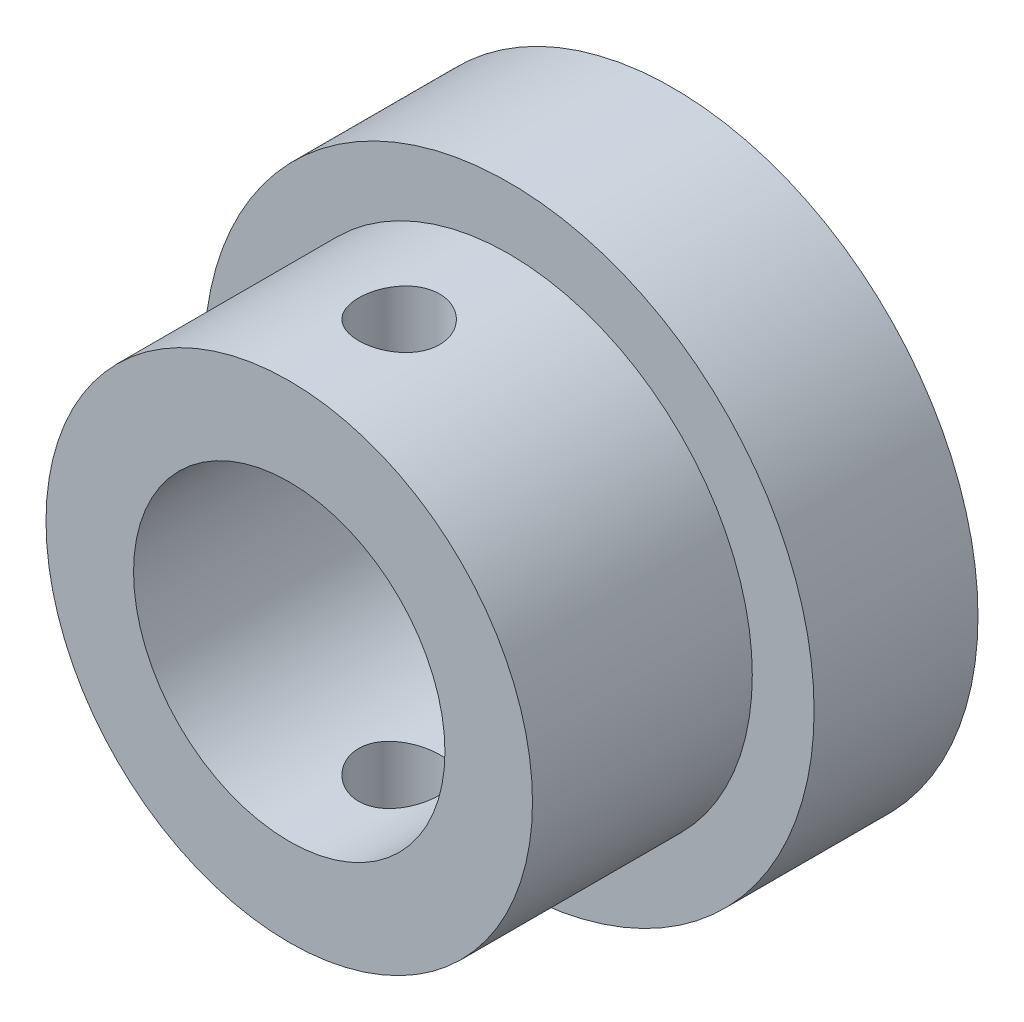
ISO-10303-21;
HEADER;
FILE_DESCRIPTION(('STEP AP214'),'2;1');
FILE_NAME('part.step','',(''),(''),'','','');
FILE_SCHEMA(('AUTOMOTIVE_DESIGN { 1 0 10303 214 1 1 1 1 }'));
ENDSEC;
DATA;
#1=APPLICATION_CONTEXT('core data for automotive mechanical design processes');
#2=APPLICATION_PROTOCOL_DEFINITION('international standard','automotive_design',2000,#1);
#3=PRODUCT_CONTEXT('',#1,'mechanical');
#4=PRODUCT('Part','Part','',(#3));
#5=PRODUCT_RELATED_PRODUCT_CATEGORY('part','',(#4));
#6=PRODUCT_DEFINITION_FORMATION('','',#4);
#7=PRODUCT_DEFINITION_CONTEXT('part definition',#1,'design');
#8=PRODUCT_DEFINITION('design','',#6,#7);
#9=PRODUCT_DEFINITION_SHAPE('','',#8);
#10=(LENGTH_UNIT() NAMED_UNIT(*) SI_UNIT(.MILLI.,.METRE.));
#11=(NAMED_UNIT(*) PLANE_ANGLE_UNIT() SI_UNIT($,.RADIAN.));
#12=(NAMED_UNIT(*) SI_UNIT($,.STERADIAN.) SOLID_ANGLE_UNIT());
#13=UNCERTAINTY_MEASURE_WITH_UNIT(LENGTH_MEASURE(1.E-05),#10,'distance_accuracy_value','');
#14=(GEOMETRIC_REPRESENTATION_CONTEXT(3) GLOBAL_UNCERTAINTY_ASSIGNED_CONTEXT((#13)) GLOBAL_UNIT_ASSIGNED_CONTEXT((#10,
#11,#12)) REPRESENTATION_CONTEXT('',''));
#15=CARTESIAN_POINT('',(0.,0.,0.));
#16=DIRECTION('',(0.,0.,1.));
#17=DIRECTION('',(1.,0.,0.));
#18=AXIS2_PLACEMENT_3D('',#15,#16,#17);
#19=CARTESIAN_POINT('',(0.,0.,8.5));
#20=DIRECTION('',(0.,0.,-1.));
#21=DIRECTION('',(-1.,0.,0.));
#22=AXIS2_PLACEMENT_3D('',#19,#20,#21);
#23=CYLINDRICAL_SURFACE('',#22,15.82);
#24=CARTESIAN_POINT('',(0.,0.,8.5));
#25=DIRECTION('',(0.,0.,1.));
#26=DIRECTION('',(1.,0.,0.));
#27=AXIS2_PLACEMENT_3D('',#24,#25,#26);
#28=CIRCLE('',#27,15.82);
#29=CARTESIAN_POINT('',(15.82,0.,8.5));
#30=VERTEX_POINT('',#29);
#31=EDGE_CURVE('E56',#30,#30,#28,.T.);
#32=ORIENTED_EDGE('',*,*,#31,.F.);
#33=EDGE_LOOP('',(#32));
#34=FACE_BOUND('',#33,.T.);
#35=CARTESIAN_POINT('',(0.,0.,0.));
#36=DIRECTION('',(0.,0.,1.));
#37=DIRECTION('',(1.,0.,0.));
#38=AXIS2_PLACEMENT_3D('',#35,#36,#37);
#39=CIRCLE('',#38,15.82);
#40=CARTESIAN_POINT('',(15.82,0.,0.));
#41=VERTEX_POINT('',#40);
#42=EDGE_CURVE('E62',#41,#41,#39,.T.);
#43=ORIENTED_EDGE('',*,*,#42,.T.);
#44=EDGE_LOOP('',(#43));
#45=FACE_BOUND('',#44,.T.);
#46=ADVANCED_FACE('F43',(#34,#45),#23,.T.);
#47=CARTESIAN_POINT('',(0.,0.,8.5));
#48=DIRECTION('',(0.,0.,1.));
#49=DIRECTION('',(1.,0.,0.));
#50=AXIS2_PLACEMENT_3D('',#47,#48,#49);
#51=PLANE('',#50);
#52=CARTESIAN_POINT('',(0.,0.,8.5));
#53=DIRECTION('',(0.,0.,1.));
#54=DIRECTION('',(1.,0.,0.));
#55=AXIS2_PLACEMENT_3D('',#52,#53,#54);
#56=CIRCLE('',#55,12.615);
#57=CARTESIAN_POINT('',(12.615,0.,8.5));
#58=VERTEX_POINT('',#57);
#59=EDGE_CURVE('E10',#58,#58,#56,.T.);
#60=ORIENTED_EDGE('',*,*,#59,.F.);
#61=EDGE_LOOP('',(#60));
#62=FACE_BOUND('',#61,.T.);
#63=ORIENTED_EDGE('',*,*,#31,.T.);
#64=EDGE_LOOP('',(#63));
#65=FACE_BOUND('',#64,.T.);
#66=ADVANCED_FACE('F108',(#62,#65),#51,.T.);
#67=CARTESIAN_POINT('',(0.,0.,0.));
#68=DIRECTION('',(0.,0.,1.));
#69=DIRECTION('',(1.,0.,0.));
#70=AXIS2_PLACEMENT_3D('',#67,#68,#69);
#71=PLANE('',#70);
#72=CARTESIAN_POINT('',(0.,0.,0.));
#73=DIRECTION('',(0.,0.,1.));
#74=DIRECTION('',(1.,0.,0.));
#75=AXIS2_PLACEMENT_3D('',#72,#73,#74);
#76=CIRCLE('',#75,8.075);
#77=CARTESIAN_POINT('',(8.075,0.,0.));
#78=VERTEX_POINT('',#77);
#79=EDGE_CURVE('E184',#78,#78,#76,.T.);
#80=ORIENTED_EDGE('',*,*,#79,.T.);
#81=EDGE_LOOP('',(#80));
#82=FACE_BOUND('',#81,.T.);
#83=ORIENTED_EDGE('',*,*,#42,.F.);
#84=EDGE_LOOP('',(#83));
#85=FACE_BOUND('',#84,.T.);
#86=ADVANCED_FACE('F106',(#82,#85),#71,.F.);
#87=CARTESIAN_POINT('',(0.,0.,19.9));
#88=DIRECTION('',(0.,0.,-1.));
#89=DIRECTION('',(-1.,0.,0.));
#90=AXIS2_PLACEMENT_3D('',#87,#88,#89);
#91=CYLINDRICAL_SURFACE('',#90,12.615);
#92=CARTESIAN_POINT('',(0.,-12.615,16.3));
#93=CARTESIAN_POINT('',(0.117090405145463,-12.6149979951424,16.2999953034061));
#94=CARTESIAN_POINT('',(0.234244762496019,-12.6133527965061,16.2901739459982));
#95=CARTESIAN_POINT('',(0.465267802156697,-12.606948197643,16.2511642685712));
#96=CARTESIAN_POINT('',(0.579133360166437,-12.6021859316816,16.2219581264391));
#97=CARTESIAN_POINT('',(0.800202935274686,-12.5900813617941,16.1450850292527));
#98=CARTESIAN_POINT('',(0.907412313518202,-12.5827411668077,16.0974331609433));
#99=CARTESIAN_POINT('',(1.11230021449141,-12.5662878661613,15.9850607363471));
#100=CARTESIAN_POINT('',(1.20997982843383,-12.5571749638451,15.9203421374488));
#101=CARTESIAN_POINT('',(1.3939808379462,-12.538089324338,15.7750166937184));
#102=CARTESIAN_POINT('',(1.48019814914859,-12.5281099108705,15.6942789272705));
#103=CARTESIAN_POINT('',(1.63792809105368,-12.50846710681,15.5194887870758));
#104=CARTESIAN_POINT('',(1.70943979447748,-12.4988037361779,15.4254355743393));
#105=CARTESIAN_POINT('',(1.83614551821716,-12.4808224645846,15.2259696071063));
#106=CARTESIAN_POINT('',(1.89123664541632,-12.4725131896728,15.1204906468871));
#107=CARTESIAN_POINT('',(1.98287939812365,-12.4582734986611,14.901614430325));
#108=CARTESIAN_POINT('',(2.01943227288597,-12.4523429222714,14.7882177081296));
#109=CARTESIAN_POINT('',(2.07263304970447,-12.4435985405567,14.5578280556389));
#110=CARTESIAN_POINT('',(2.08946062077617,-12.4407566196536,14.4408777011733));
#111=CARTESIAN_POINT('',(2.10329017495741,-12.4384262608812,14.2057815073396));
#112=CARTESIAN_POINT('',(2.10029355780353,-12.4389375862474,14.0876357529638));
#113=CARTESIAN_POINT('',(2.07470615099254,-12.4432302770752,13.854784902341));
#114=CARTESIAN_POINT('',(2.05231717418089,-12.4469779611269,13.7400569180807));
#115=CARTESIAN_POINT('',(1.98889729289166,-12.4572683766694,13.5160088044262));
#116=CARTESIAN_POINT('',(1.94786575043135,-12.4638112038146,13.4066888602469));
#117=CARTESIAN_POINT('',(1.84812079533438,-12.4789910861851,13.1959557313876));
#118=CARTESIAN_POINT('',(1.78932355818068,-12.4876380308445,13.0945829644808));
#119=CARTESIAN_POINT('',(1.65577576903985,-12.5060449837134,12.9030659733394));
#120=CARTESIAN_POINT('',(1.58102393244177,-12.5158050815208,12.8129226541884));
#121=CARTESIAN_POINT('',(1.41658919906534,-12.535486624781,12.6452551958064));
#122=CARTESIAN_POINT('',(1.32673314604142,-12.5454085732725,12.567900832745));
#123=CARTESIAN_POINT('',(1.1352263466953,-12.5641843238819,12.429342129774));
#124=CARTESIAN_POINT('',(1.03357552471818,-12.5730381191477,12.3681378934639));
#125=CARTESIAN_POINT('',(0.82120520124206,-12.5886925137681,12.2636014380403));
#126=CARTESIAN_POINT('',(0.710478193856231,-12.5954913915055,12.2202841936475));
#127=CARTESIAN_POINT('',(0.483182211548695,-12.6062560645897,12.1529087788152));
#128=CARTESIAN_POINT('',(0.366613725024102,-12.6102220963649,12.1288490011337));
#129=CARTESIAN_POINT('',(0.132407075119206,-12.6148424263685,12.1009015872823));
#130=CARTESIAN_POINT('',(0.0147974522636623,-12.6155349867859,12.0967808783917));
#131=CARTESIAN_POINT('',(-0.219431767433047,-12.6136351303052,12.1082072268546));
#132=CARTESIAN_POINT('',(-0.336051402100723,-12.6110428394922,12.1237535293139));
#133=CARTESIAN_POINT('',(-0.564270499835416,-12.6028882470064,12.1738787458371));
#134=CARTESIAN_POINT('',(-0.675896000683405,-12.59734395419,12.2083422931837));
#135=CARTESIAN_POINT('',(-0.891784796815733,-12.5839045637239,12.2952007370322));
#136=CARTESIAN_POINT('',(-0.996047679089691,-12.5760093343265,12.3475966384976));
#137=CARTESIAN_POINT('',(-1.195264130417,-12.5586490789079,12.4693664363102));
#138=CARTESIAN_POINT('',(-1.29012751697149,-12.5491708261534,12.5388859500024));
#139=CARTESIAN_POINT('',(-1.46692482088962,-12.5297358967021,12.6927292238493));
#140=CARTESIAN_POINT('',(-1.54885780066186,-12.5197791853802,12.7770540566107));
#141=CARTESIAN_POINT('',(-1.69833226030131,-12.5003858344664,12.9591595142942));
#142=CARTESIAN_POINT('',(-1.76571628213398,-12.4909556319804,13.0570701763791));
#143=CARTESIAN_POINT('',(-1.88308041907004,-12.4738031821253,13.2629580369427));
#144=CARTESIAN_POINT('',(-1.93306108490452,-12.4660808807123,13.3709349167377));
#145=CARTESIAN_POINT('',(-2.01396414935522,-12.4532668581825,13.5934495175217));
#146=CARTESIAN_POINT('',(-2.04496497813,-12.4481643257406,13.7079580717201));
#147=CARTESIAN_POINT('',(-2.08727519645551,-12.4411404289967,13.9406491282067));
#148=CARTESIAN_POINT('',(-2.09858629346993,-12.4392187888532,14.0588313110186));
#149=CARTESIAN_POINT('',(-2.10114843878461,-12.4387861195739,14.2939425583894));
#150=CARTESIAN_POINT('',(-2.09264733277958,-12.4402329514662,14.4108689184299));
#151=CARTESIAN_POINT('',(-2.05636225169382,-12.4462818606994,14.6416028954854));
#152=CARTESIAN_POINT('',(-2.02857833868577,-12.4508839278836,14.7554105225386));
#153=CARTESIAN_POINT('',(-1.95461117967956,-12.4627087734664,14.9765809470632));
#154=CARTESIAN_POINT('',(-1.90844922220213,-12.469928518772,15.0839510365665));
#155=CARTESIAN_POINT('',(-1.79906180289613,-12.486178189114,15.2894627565796));
#156=CARTESIAN_POINT('',(-1.7358354980487,-12.4952082035762,15.3876039308364));
#157=CARTESIAN_POINT('',(-1.59322942879022,-12.514194569954,15.5731242093798));
#158=CARTESIAN_POINT('',(-1.51366731579548,-12.5241606216413,15.6603621729205));
#159=CARTESIAN_POINT('',(-1.34103255529392,-12.5438187272978,15.820333957209));
#160=CARTESIAN_POINT('',(-1.24795679384264,-12.5535107174983,15.8930644258062));
#161=CARTESIAN_POINT('',(-1.05017499467409,-12.5716060111072,16.0224143446602));
#162=CARTESIAN_POINT('',(-0.945393264380169,-12.5799999783229,16.0789193729301));
#163=CARTESIAN_POINT('',(-0.727728249262895,-12.5944625680724,16.1734389234143));
#164=CARTESIAN_POINT('',(-0.614853166402668,-12.6005335063423,16.2114718699599));
#165=CARTESIAN_POINT('',(-0.417948959566506,-12.608340471702,16.2597081483539));
#166=CARTESIAN_POINT('',(-0.33511125674187,-12.6108244523752,16.2747934066568));
#167=CARTESIAN_POINT('',(-0.1681933557398,-12.6141549225872,16.2949409334499));
#168=CARTESIAN_POINT('',(-0.0841131788979997,-12.6150014402115,16.3000033738499));
#169=CARTESIAN_POINT('',(0.,-12.615,16.3));
#170=B_SPLINE_CURVE_WITH_KNOTS('',3,(#92,#93,#94,#95,#96,#97,#98,#99,#100,#101,#102,#103,#104,
#105,#106,#107,#108,#109,#110,#111,#112,#113,#114,#115,#116,#117,#118,#119,#120,#121,#122,#123,
#124,#125,#126,#127,#128,#129,#130,#131,#132,#133,#134,#135,#136,#137,#138,#139,#140,#141,#142,
#143,#144,#145,#146,#147,#148,#149,#150,#151,#152,#153,#154,#155,#156,#157,#158,#159,#160,#161,
#162,#163,#164,#165,#166,#167,#168,#169),.UNSPECIFIED.,.T.,.F.,(4,2,2,2,2,2,2,2,2,2,2,2,2,2,2,2,
2,2,2,2,2,2,2,2,2,2,2,2,2,2,2,2,2,2,2,2,2,2,4),(0.,0.350963758331684,0.702250635861975,
1.05325080115011,1.40421072761578,1.75816680789181,2.11214520043376,2.46829715575193,
2.82442510754323,3.17728340175088,3.53011678177853,3.87932181268244,4.22853879492235,
4.57942993622639,4.93034934077613,5.2856068642165,5.64086666650275,5.99642328689567,
6.35195022918237,6.70331112033582,7.05465852534324,7.40388666950032,7.75313438827724,
8.10546132835634,8.45781380414244,8.81380719521221,9.16978931980863,9.52429031602075,
9.87876056891219,10.2288203315031,10.5788789672326,10.9285332809399,11.2782048715549,
11.6320155011516,11.9859077889616,12.3422376584922,12.6982113856478,12.9503343815631,
13.2024530530682),.UNSPECIFIED.);
#171=CARTESIAN_POINT('',(0.,-12.615,16.3));
#172=VERTEX_POINT('',#171);
#173=EDGE_CURVE('E96',#172,#172,#170,.T.);
#174=ORIENTED_EDGE('',*,*,#173,.T.);
#175=EDGE_LOOP('',(#174));
#176=FACE_BOUND('',#175,.T.);
#177=CARTESIAN_POINT('',(0.,12.615,16.3));
#178=CARTESIAN_POINT('',(-0.117090405145463,12.6149979951424,16.2999953034061));
#179=CARTESIAN_POINT('',(-0.234244762496019,12.6133527965061,16.2901739459982));
#180=CARTESIAN_POINT('',(-0.465267802156697,12.606948197643,16.2511642685712));
#181=CARTESIAN_POINT('',(-0.579133360166437,12.6021859316816,16.2219581264391));
#182=CARTESIAN_POINT('',(-0.800202935274686,12.5900813617941,16.1450850292527));
#183=CARTESIAN_POINT('',(-0.907412313518202,12.5827411668077,16.0974331609433));
#184=CARTESIAN_POINT('',(-1.11230021449141,12.5662878661613,15.9850607363471));
#185=CARTESIAN_POINT('',(-1.20997982843383,12.5571749638451,15.9203421374488));
#186=CARTESIAN_POINT('',(-1.3939808379462,12.538089324338,15.7750166937184));
#187=CARTESIAN_POINT('',(-1.48019814914859,12.5281099108705,15.6942789272705));
#188=CARTESIAN_POINT('',(-1.63792809105368,12.50846710681,15.5194887870758));
#189=CARTESIAN_POINT('',(-1.70943979447748,12.4988037361779,15.4254355743393));
#190=CARTESIAN_POINT('',(-1.83614551821716,12.4808224645846,15.2259696071063));
#191=CARTESIAN_POINT('',(-1.89123664541632,12.4725131896728,15.1204906468871));
#192=CARTESIAN_POINT('',(-1.98287939812365,12.4582734986611,14.901614430325));
#193=CARTESIAN_POINT('',(-2.01943227288597,12.4523429222714,14.7882177081296));
#194=CARTESIAN_POINT('',(-2.07263304970447,12.4435985405567,14.5578280556389));
#195=CARTESIAN_POINT('',(-2.08946062077617,12.4407566196536,14.4408777011733));
#196=CARTESIAN_POINT('',(-2.10329017495741,12.4384262608812,14.2057815073396));
#197=CARTESIAN_POINT('',(-2.10029355780353,12.4389375862474,14.0876357529638));
#198=CARTESIAN_POINT('',(-2.07470615099254,12.4432302770752,13.854784902341));
#199=CARTESIAN_POINT('',(-2.05231717418089,12.4469779611269,13.7400569180807));
#200=CARTESIAN_POINT('',(-1.98889729289166,12.4572683766694,13.5160088044262));
#201=CARTESIAN_POINT('',(-1.94786575043135,12.4638112038146,13.4066888602469));
#202=CARTESIAN_POINT('',(-1.84812079533438,12.4789910861851,13.1959557313876));
#203=CARTESIAN_POINT('',(-1.78932355818068,12.4876380308445,13.0945829644808));
#204=CARTESIAN_POINT('',(-1.65577576903985,12.5060449837134,12.9030659733394));
#205=CARTESIAN_POINT('',(-1.58102393244177,12.5158050815208,12.8129226541884));
#206=CARTESIAN_POINT('',(-1.41658919906534,12.535486624781,12.6452551958064));
#207=CARTESIAN_POINT('',(-1.32673314604142,12.5454085732725,12.567900832745));
#208=CARTESIAN_POINT('',(-1.1352263466953,12.5641843238819,12.429342129774));
#209=CARTESIAN_POINT('',(-1.03357552471818,12.5730381191477,12.3681378934639));
#210=CARTESIAN_POINT('',(-0.82120520124206,12.5886925137681,12.2636014380403));
#211=CARTESIAN_POINT('',(-0.710478193856231,12.5954913915055,12.2202841936475));
#212=CARTESIAN_POINT('',(-0.483182211548695,12.6062560645897,12.1529087788152));
#213=CARTESIAN_POINT('',(-0.366613725024102,12.6102220963649,12.1288490011337));
#214=CARTESIAN_POINT('',(-0.132407075119206,12.6148424263685,12.1009015872823));
#215=CARTESIAN_POINT('',(-0.0147974522636623,12.6155349867859,12.0967808783917));
#216=CARTESIAN_POINT('',(0.219431767433047,12.6136351303052,12.1082072268546));
#217=CARTESIAN_POINT('',(0.336051402100723,12.6110428394922,12.1237535293139));
#218=CARTESIAN_POINT('',(0.564270499835416,12.6028882470064,12.1738787458371));
#219=CARTESIAN_POINT('',(0.675896000683405,12.59734395419,12.2083422931837));
#220=CARTESIAN_POINT('',(0.891784796815733,12.5839045637239,12.2952007370322));
#221=CARTESIAN_POINT('',(0.996047679089691,12.5760093343265,12.3475966384976));
#222=CARTESIAN_POINT('',(1.195264130417,12.5586490789079,12.4693664363102));
#223=CARTESIAN_POINT('',(1.29012751697149,12.5491708261534,12.5388859500024));
#224=CARTESIAN_POINT('',(1.46692482088962,12.5297358967021,12.6927292238493));
#225=CARTESIAN_POINT('',(1.54885780066186,12.5197791853802,12.7770540566107));
#226=CARTESIAN_POINT('',(1.69833226030131,12.5003858344664,12.9591595142942));
#227=CARTESIAN_POINT('',(1.76571628213398,12.4909556319804,13.0570701763791));
#228=CARTESIAN_POINT('',(1.88308041907004,12.4738031821253,13.2629580369427));
#229=CARTESIAN_POINT('',(1.93306108490452,12.4660808807123,13.3709349167377));
#230=CARTESIAN_POINT('',(2.01396414935522,12.4532668581825,13.5934495175217));
#231=CARTESIAN_POINT('',(2.04496497813,12.4481643257406,13.7079580717201));
#232=CARTESIAN_POINT('',(2.08727519645551,12.4411404289967,13.9406491282067));
#233=CARTESIAN_POINT('',(2.09858629346993,12.4392187888532,14.0588313110186));
#234=CARTESIAN_POINT('',(2.10114843878461,12.4387861195739,14.2939425583894));
#235=CARTESIAN_POINT('',(2.09264733277958,12.4402329514662,14.4108689184299));
#236=CARTESIAN_POINT('',(2.05636225169382,12.4462818606994,14.6416028954854));
#237=CARTESIAN_POINT('',(2.02857833868577,12.4508839278836,14.7554105225386));
#238=CARTESIAN_POINT('',(1.95461117967956,12.4627087734664,14.9765809470632));
#239=CARTESIAN_POINT('',(1.90844922220213,12.469928518772,15.0839510365665));
#240=CARTESIAN_POINT('',(1.79906180289613,12.486178189114,15.2894627565796));
#241=CARTESIAN_POINT('',(1.7358354980487,12.4952082035762,15.3876039308364));
#242=CARTESIAN_POINT('',(1.59322942879022,12.514194569954,15.5731242093798));
#243=CARTESIAN_POINT('',(1.51366731579548,12.5241606216413,15.6603621729205));
#244=CARTESIAN_POINT('',(1.34103255529392,12.5438187272978,15.820333957209));
#245=CARTESIAN_POINT('',(1.24795679384264,12.5535107174983,15.8930644258062));
#246=CARTESIAN_POINT('',(1.05017499467409,12.5716060111072,16.0224143446602));
#247=CARTESIAN_POINT('',(0.945393264380169,12.5799999783229,16.0789193729301));
#248=CARTESIAN_POINT('',(0.727728249262895,12.5944625680724,16.1734389234143));
#249=CARTESIAN_POINT('',(0.614853166402668,12.6005335063423,16.2114718699599));
#250=CARTESIAN_POINT('',(0.417948959566506,12.608340471702,16.2597081483539));
#251=CARTESIAN_POINT('',(0.33511125674187,12.6108244523752,16.2747934066568));
#252=CARTESIAN_POINT('',(0.1681933557398,12.6141549225872,16.2949409334499));
#253=CARTESIAN_POINT('',(0.0841131788979997,12.6150014402115,16.3000033738499));
#254=CARTESIAN_POINT('',(0.,12.615,16.3));
#255=B_SPLINE_CURVE_WITH_KNOTS('',3,(#177,#178,#179,#180,#181,#182,#183,#184,#185,#186,#187,
#188,#189,#190,#191,#192,#193,#194,#195,#196,#197,#198,#199,#200,#201,#202,#203,#204,#205,#206,
#207,#208,#209,#210,#211,#212,#213,#214,#215,#216,#217,#218,#219,#220,#221,#222,#223,#224,#225,
#226,#227,#228,#229,#230,#231,#232,#233,#234,#235,#236,#237,#238,#239,#240,#241,#242,#243,#244,
#245,#246,#247,#248,#249,#250,#251,#252,#253,#254),.UNSPECIFIED.,.T.,.F.,(4,2,2,2,2,2,2,2,2,2,2,
2,2,2,2,2,2,2,2,2,2,2,2,2,2,2,2,2,2,2,2,2,2,2,2,2,2,2,4),(0.,0.350963758331684,
0.702250635861975,1.05325080115011,1.40421072761578,1.75816680789181,2.11214520043376,
2.46829715575193,2.82442510754323,3.17728340175088,3.53011678177853,3.87932181268244,
4.22853879492235,4.57942993622639,4.93034934077613,5.2856068642165,5.64086666650275,
5.99642328689567,6.35195022918237,6.70331112033582,7.05465852534324,7.40388666950032,
7.75313438827724,8.10546132835634,8.45781380414244,8.81380719521221,9.16978931980863,
9.52429031602075,9.87876056891219,10.2288203315031,10.5788789672326,10.9285332809399,
11.2782048715549,11.6320155011516,11.9859077889616,12.3422376584922,12.6982113856478,
12.9503343815631,13.2024530530682),.UNSPECIFIED.);
#256=CARTESIAN_POINT('',(0.,12.615,16.3));
#257=VERTEX_POINT('',#256);
#258=EDGE_CURVE('E89',#257,#257,#255,.T.);
#259=ORIENTED_EDGE('',*,*,#258,.T.);
#260=EDGE_LOOP('',(#259));
#261=FACE_BOUND('',#260,.T.);
#262=CARTESIAN_POINT('',(0.,0.,19.9));
#263=DIRECTION('',(0.,0.,1.));
#264=DIRECTION('',(1.,0.,0.));
#265=AXIS2_PLACEMENT_3D('',#262,#263,#264);
#266=CIRCLE('',#265,12.615);
#267=CARTESIAN_POINT('',(12.615,0.,19.9));
#268=VERTEX_POINT('',#267);
#269=EDGE_CURVE('E65',#268,#268,#266,.T.);
#270=ORIENTED_EDGE('',*,*,#269,.F.);
#271=EDGE_LOOP('',(#270));
#272=FACE_BOUND('',#271,.T.);
#273=ORIENTED_EDGE('',*,*,#59,.T.);
#274=EDGE_LOOP('',(#273));
#275=FACE_BOUND('',#274,.T.);
#276=ADVANCED_FACE('F101',(#176,#261,#272,#275),#91,.T.);
#277=CARTESIAN_POINT('',(0.,0.,19.9));
#278=DIRECTION('',(0.,0.,1.));
#279=DIRECTION('',(1.,0.,0.));
#280=AXIS2_PLACEMENT_3D('',#277,#278,#279);
#281=PLANE('',#280);
#282=CARTESIAN_POINT('',(0.,0.,19.9));
#283=DIRECTION('',(0.,0.,1.));
#284=DIRECTION('',(1.,0.,0.));
#285=AXIS2_PLACEMENT_3D('',#282,#283,#284);
#286=CIRCLE('',#285,8.075);
#287=CARTESIAN_POINT('',(8.075,0.,19.9));
#288=VERTEX_POINT('',#287);
#289=EDGE_CURVE('E186',#288,#288,#286,.T.);
#290=ORIENTED_EDGE('',*,*,#289,.F.);
#291=EDGE_LOOP('',(#290));
#292=FACE_BOUND('',#291,.T.);
#293=ORIENTED_EDGE('',*,*,#269,.T.);
#294=EDGE_LOOP('',(#293));
#295=FACE_BOUND('',#294,.T.);
#296=ADVANCED_FACE('F105',(#292,#295),#281,.T.);
#297=CARTESIAN_POINT('',(0.,0.,0.));
#298=DIRECTION('',(0.,0.,1.));
#299=DIRECTION('',(1.,0.,0.));
#300=AXIS2_PLACEMENT_3D('',#297,#298,#299);
#301=CYLINDRICAL_SURFACE('',#300,8.075);
#302=CARTESIAN_POINT('',(0.,-8.075,16.3));
#303=CARTESIAN_POINT('',(-0.115871827424154,-8.07499815788605,16.2999970390839));
#304=CARTESIAN_POINT('',(-0.231775906926112,-8.07248128670506,16.2903776012231));
#305=CARTESIAN_POINT('',(-0.460252064256596,-8.06268519251354,16.2522178774469));
#306=CARTESIAN_POINT('',(-0.572822392621185,-8.05540351377743,16.2236678348201));
#307=CARTESIAN_POINT('',(-0.791299503739305,-8.03688257153905,16.1486326915667));
#308=CARTESIAN_POINT('',(-0.89721444873294,-8.02564827181474,16.1021700789166));
#309=CARTESIAN_POINT('',(-1.09974787488678,-8.00041304967934,15.9927103628068));
#310=CARTESIAN_POINT('',(-1.19636585795492,-7.98641197915889,15.9297123741247));
#311=CARTESIAN_POINT('',(-1.3797023703087,-7.95681154209011,15.7874969472279));
#312=CARTESIAN_POINT('',(-1.46618567650681,-7.94118591687267,15.7079817274427));
#313=CARTESIAN_POINT('',(-1.62475195125285,-7.91026841980203,15.5356259427291));
#314=CARTESIAN_POINT('',(-1.6968331603921,-7.89497658892928,15.4427837521109));
#315=CARTESIAN_POINT('',(-1.82567958964906,-7.8661910558391,15.2445525625502));
#316=CARTESIAN_POINT('',(-1.88217722434653,-7.85273056788817,15.1389843740494));
#317=CARTESIAN_POINT('',(-1.97653032740086,-7.82951659403045,14.9194413952651));
#318=CARTESIAN_POINT('',(-2.01438904721761,-7.81976246163738,14.8054680752036));
#319=CARTESIAN_POINT('',(-2.06957855821683,-7.80533621431595,14.5749478048913));
#320=CARTESIAN_POINT('',(-2.08733441059276,-7.80055904612993,14.4585093512755));
#321=CARTESIAN_POINT('',(-2.10313888292929,-7.79631351135099,14.2242159182912));
#322=CARTESIAN_POINT('',(-2.10119099132225,-7.79684420503206,14.1063611933555));
#323=CARTESIAN_POINT('',(-2.07798140194552,-7.80306024129093,13.8758740025415));
#324=CARTESIAN_POINT('',(-2.05723085616647,-7.80860915531351,13.7631858044134));
#325=CARTESIAN_POINT('',(-1.99782234336147,-7.82401837736178,13.5429478648741));
#326=CARTESIAN_POINT('',(-1.95916300768083,-7.83387901490178,13.4353985168856));
#327=CARTESIAN_POINT('',(-1.86461013792829,-7.85692271510677,13.2271434285085));
#328=CARTESIAN_POINT('',(-1.80853486908354,-7.87014053155793,13.1265242077332));
#329=CARTESIAN_POINT('',(-1.68086881154182,-7.89839021652879,12.9359424864975));
#330=CARTESIAN_POINT('',(-1.60927510444815,-7.9134224260272,12.8459819954455));
#331=CARTESIAN_POINT('',(-1.44997710627677,-7.94417768020489,12.6763473626967));
#332=CARTESIAN_POINT('',(-1.3618427142753,-7.95990770564848,12.5970778358259));
#333=CARTESIAN_POINT('',(-1.17334067744893,-7.98986800347974,12.4543634935913));
#334=CARTESIAN_POINT('',(-1.0729725962178,-8.00409822233179,12.3909192430008));
#335=CARTESIAN_POINT('',(-0.862245588790804,-8.02953613283629,12.2814902797917));
#336=CARTESIAN_POINT('',(-0.751848644210953,-8.0407316223874,12.2355757576579));
#337=CARTESIAN_POINT('',(-0.524545957278586,-8.05875025845912,12.1630723677646));
#338=CARTESIAN_POINT('',(-0.407641570865597,-8.06557431216582,12.1364794901097));
#339=CARTESIAN_POINT('',(-0.174098088141374,-8.07394518304003,12.1040025428632));
#340=CARTESIAN_POINT('',(-0.0575404520394964,-8.07563223893502,12.097568010568));
#341=CARTESIAN_POINT('',(0.174987522588724,-8.07394070236264,12.1040744312751));
#342=CARTESIAN_POINT('',(0.290957917519187,-8.07056260602884,12.117013486627));
#343=CARTESIAN_POINT('',(0.517075671335545,-8.05921063279311,12.1614473443897));
#344=CARTESIAN_POINT('',(0.627286962720303,-8.05131217294138,12.1926378299613));
#345=CARTESIAN_POINT('',(0.840904336533513,-8.03181296842914,12.2723381155217));
#346=CARTESIAN_POINT('',(0.944309699338374,-8.02021183302305,12.3208497434852));
#347=CARTESIAN_POINT('',(1.1435395205331,-7.99426254301436,12.4348546771997));
#348=CARTESIAN_POINT('',(1.23918421109676,-7.97986670399213,12.5006510159775));
#349=CARTESIAN_POINT('',(1.41826906845428,-7.94999337305592,12.6469741487984));
#350=CARTESIAN_POINT('',(1.50170694185814,-7.93451567869047,12.7275037045061));
#351=CARTESIAN_POINT('',(1.65630879109929,-7.90371154527326,12.9035712331707));
#352=CARTESIAN_POINT('',(1.72708524550091,-7.88840019770937,12.9994527309878));
#353=CARTESIAN_POINT('',(1.85154857471353,-7.86011973232361,13.2020523335951));
#354=CARTESIAN_POINT('',(1.90523618627563,-7.847150513536,13.3087699709452));
#355=CARTESIAN_POINT('',(1.99359403204249,-7.825169762581,13.5294606880192));
#356=CARTESIAN_POINT('',(2.02837591526294,-7.81613505931003,13.6433866358954));
#357=CARTESIAN_POINT('',(2.0782123995793,-7.80303368957822,13.8757431035615));
#358=CARTESIAN_POINT('',(2.09327174409945,-7.79896582856905,13.9941725331752));
#359=CARTESIAN_POINT('',(2.10297275547962,-7.7963550192497,14.2282166349057));
#360=CARTESIAN_POINT('',(2.09823582825744,-7.79764391496779,14.3438040701792));
#361=CARTESIAN_POINT('',(2.06991243787169,-7.8052096728301,14.5724710808921));
#362=CARTESIAN_POINT('',(2.04632641559524,-7.8114864183067,14.6855507149261));
#363=CARTESIAN_POINT('',(1.98132636088469,-7.82822308488921,14.9052530874019));
#364=CARTESIAN_POINT('',(1.94003790765334,-7.83865350384139,15.0119153831566));
#365=CARTESIAN_POINT('',(1.84090312666794,-7.86252431515174,15.2168779065387));
#366=CARTESIAN_POINT('',(1.78305432004485,-7.87596515806555,15.315176879426));
#367=CARTESIAN_POINT('',(1.65053155625944,-7.90481400022032,15.5036034302199));
#368=CARTESIAN_POINT('',(1.57543065640827,-7.92026664870569,15.5934239415864));
#369=CARTESIAN_POINT('',(1.41135561074052,-7.95114185174705,15.7593895973354));
#370=CARTESIAN_POINT('',(1.32237813043122,-7.96656439816537,15.8355314452957));
#371=CARTESIAN_POINT('',(1.13092336578401,-7.99601105142036,15.9734738648594));
#372=CARTESIAN_POINT('',(1.02821124385345,-8.01000093269915,16.0349563972789));
#373=CARTESIAN_POINT('',(0.813550841608095,-8.03463718970854,16.1396843066057));
#374=CARTESIAN_POINT('',(0.701608830458552,-8.04528581166144,16.1829419422647));
#375=CARTESIAN_POINT('',(0.491660634954398,-8.0605826159974,16.2440337603681));
#376=CARTESIAN_POINT('',(0.394599084716608,-8.06595065841885,16.2649737395439));
#377=CARTESIAN_POINT('',(0.198366109784046,-8.07315998246533,16.292957510303));
#378=CARTESIAN_POINT('',(0.0991948730677301,-8.07500157698608,16.3000025347636));
#379=CARTESIAN_POINT('',(0.,-8.075,16.3));
#380=B_SPLINE_CURVE_WITH_KNOTS('',3,(#302,#303,#304,#305,#306,#307,#308,#309,#310,#311,#312,
#313,#314,#315,#316,#317,#318,#319,#320,#321,#322,#323,#324,#325,#326,#327,#328,#329,#330,#331,
#332,#333,#334,#335,#336,#337,#338,#339,#340,#341,#342,#343,#344,#345,#346,#347,#348,#349,#350,
#351,#352,#353,#354,#355,#356,#357,#358,#359,#360,#361,#362,#363,#364,#365,#366,#367,#368,#369,
#370,#371,#372,#373,#374,#375,#376,#377,#378,#379),.UNSPECIFIED.,.T.,.F.,(4,2,2,2,2,2,2,2,2,2,2,
2,2,2,2,2,2,2,2,2,2,2,2,2,2,2,2,2,2,2,2,2,2,2,2,2,2,2,4),(0.,0.347251815022119,
0.694682740642506,1.04167890402442,1.38869364766054,1.74261303210576,2.09657562613492,
2.4562834299754,2.81592846244295,3.16781808133873,3.51964540133122,3.86218611257907,
4.20475300635028,4.55102201767935,4.89735620492654,5.25441115945375,5.6114788547516,
5.96996164750229,6.32837002167273,6.67690202685879,7.02539989543371,7.36824625795266,
7.71112881322446,8.06047845371332,8.40989364518772,8.76864503771846,9.12738096130823,
9.48397467023088,9.84048259982847,10.1858851668707,10.5312796550588,10.8742634690736,
11.2172986501637,11.5699689238689,11.9227240739293,12.2825496807864,12.642132867481,
12.9394325406784,13.2367058337591),.UNSPECIFIED.);
#381=CARTESIAN_POINT('',(0.,-8.075,16.3));
#382=VERTEX_POINT('',#381);
#383=EDGE_CURVE('E46',#382,#382,#380,.T.);
#384=ORIENTED_EDGE('',*,*,#383,.T.);
#385=EDGE_LOOP('',(#384));
#386=FACE_BOUND('',#385,.T.);
#387=CARTESIAN_POINT('',(0.,8.075,16.3));
#388=CARTESIAN_POINT('',(0.115871827424154,8.07499815788605,16.2999970390839));
#389=CARTESIAN_POINT('',(0.231775906926112,8.07248128670506,16.2903776012231));
#390=CARTESIAN_POINT('',(0.460252064256596,8.06268519251354,16.2522178774469));
#391=CARTESIAN_POINT('',(0.572822392621185,8.05540351377743,16.2236678348201));
#392=CARTESIAN_POINT('',(0.791299503739305,8.03688257153905,16.1486326915667));
#393=CARTESIAN_POINT('',(0.89721444873294,8.02564827181474,16.1021700789166));
#394=CARTESIAN_POINT('',(1.09974787488678,8.00041304967934,15.9927103628068));
#395=CARTESIAN_POINT('',(1.19636585795492,7.98641197915889,15.9297123741247));
#396=CARTESIAN_POINT('',(1.3797023703087,7.95681154209011,15.7874969472279));
#397=CARTESIAN_POINT('',(1.46618567650681,7.94118591687267,15.7079817274427));
#398=CARTESIAN_POINT('',(1.62475195125285,7.91026841980203,15.5356259427291));
#399=CARTESIAN_POINT('',(1.6968331603921,7.89497658892928,15.4427837521109));
#400=CARTESIAN_POINT('',(1.82567958964906,7.8661910558391,15.2445525625502));
#401=CARTESIAN_POINT('',(1.88217722434653,7.85273056788817,15.1389843740494));
#402=CARTESIAN_POINT('',(1.97653032740086,7.82951659403045,14.9194413952651));
#403=CARTESIAN_POINT('',(2.01438904721761,7.81976246163738,14.8054680752036));
#404=CARTESIAN_POINT('',(2.06957855821683,7.80533621431595,14.5749478048913));
#405=CARTESIAN_POINT('',(2.08733441059276,7.80055904612993,14.4585093512755));
#406=CARTESIAN_POINT('',(2.10313888292929,7.79631351135099,14.2242159182912));
#407=CARTESIAN_POINT('',(2.10119099132225,7.79684420503206,14.1063611933555));
#408=CARTESIAN_POINT('',(2.07798140194552,7.80306024129093,13.8758740025415));
#409=CARTESIAN_POINT('',(2.05723085616647,7.80860915531351,13.7631858044134));
#410=CARTESIAN_POINT('',(1.99782234336147,7.82401837736178,13.5429478648741));
#411=CARTESIAN_POINT('',(1.95916300768083,7.83387901490178,13.4353985168856));
#412=CARTESIAN_POINT('',(1.86461013792829,7.85692271510677,13.2271434285085));
#413=CARTESIAN_POINT('',(1.80853486908354,7.87014053155793,13.1265242077332));
#414=CARTESIAN_POINT('',(1.68086881154182,7.89839021652879,12.9359424864975));
#415=CARTESIAN_POINT('',(1.60927510444815,7.9134224260272,12.8459819954455));
#416=CARTESIAN_POINT('',(1.44997710627677,7.94417768020489,12.6763473626967));
#417=CARTESIAN_POINT('',(1.3618427142753,7.95990770564848,12.5970778358259));
#418=CARTESIAN_POINT('',(1.17334067744893,7.98986800347974,12.4543634935913));
#419=CARTESIAN_POINT('',(1.0729725962178,8.00409822233179,12.3909192430008));
#420=CARTESIAN_POINT('',(0.862245588790804,8.02953613283629,12.2814902797917));
#421=CARTESIAN_POINT('',(0.751848644210953,8.0407316223874,12.2355757576579));
#422=CARTESIAN_POINT('',(0.524545957278586,8.05875025845912,12.1630723677646));
#423=CARTESIAN_POINT('',(0.407641570865597,8.06557431216582,12.1364794901097));
#424=CARTESIAN_POINT('',(0.174098088141374,8.07394518304003,12.1040025428632));
#425=CARTESIAN_POINT('',(0.0575404520394964,8.07563223893502,12.097568010568));
#426=CARTESIAN_POINT('',(-0.174987522588724,8.07394070236264,12.1040744312751));
#427=CARTESIAN_POINT('',(-0.290957917519187,8.07056260602884,12.117013486627));
#428=CARTESIAN_POINT('',(-0.517075671335545,8.05921063279311,12.1614473443897));
#429=CARTESIAN_POINT('',(-0.627286962720303,8.05131217294138,12.1926378299613));
#430=CARTESIAN_POINT('',(-0.840904336533513,8.03181296842914,12.2723381155217));
#431=CARTESIAN_POINT('',(-0.944309699338374,8.02021183302305,12.3208497434852));
#432=CARTESIAN_POINT('',(-1.1435395205331,7.99426254301436,12.4348546771997));
#433=CARTESIAN_POINT('',(-1.23918421109676,7.97986670399213,12.5006510159775));
#434=CARTESIAN_POINT('',(-1.41826906845428,7.94999337305592,12.6469741487984));
#435=CARTESIAN_POINT('',(-1.50170694185814,7.93451567869047,12.7275037045061));
#436=CARTESIAN_POINT('',(-1.65630879109929,7.90371154527326,12.9035712331707));
#437=CARTESIAN_POINT('',(-1.72708524550091,7.88840019770937,12.9994527309878));
#438=CARTESIAN_POINT('',(-1.85154857471353,7.86011973232361,13.2020523335951));
#439=CARTESIAN_POINT('',(-1.90523618627563,7.847150513536,13.3087699709452));
#440=CARTESIAN_POINT('',(-1.99359403204249,7.825169762581,13.5294606880192));
#441=CARTESIAN_POINT('',(-2.02837591526294,7.81613505931003,13.6433866358954));
#442=CARTESIAN_POINT('',(-2.0782123995793,7.80303368957822,13.8757431035615));
#443=CARTESIAN_POINT('',(-2.09327174409945,7.79896582856905,13.9941725331752));
#444=CARTESIAN_POINT('',(-2.10297275547962,7.7963550192497,14.2282166349057));
#445=CARTESIAN_POINT('',(-2.09823582825744,7.79764391496779,14.3438040701792));
#446=CARTESIAN_POINT('',(-2.06991243787169,7.8052096728301,14.5724710808921));
#447=CARTESIAN_POINT('',(-2.04632641559524,7.8114864183067,14.6855507149261));
#448=CARTESIAN_POINT('',(-1.98132636088469,7.82822308488921,14.9052530874019));
#449=CARTESIAN_POINT('',(-1.94003790765334,7.83865350384139,15.0119153831566));
#450=CARTESIAN_POINT('',(-1.84090312666794,7.86252431515174,15.2168779065387));
#451=CARTESIAN_POINT('',(-1.78305432004485,7.87596515806555,15.315176879426));
#452=CARTESIAN_POINT('',(-1.65053155625944,7.90481400022032,15.5036034302199));
#453=CARTESIAN_POINT('',(-1.57543065640827,7.92026664870569,15.5934239415864));
#454=CARTESIAN_POINT('',(-1.41135561074052,7.95114185174705,15.7593895973354));
#455=CARTESIAN_POINT('',(-1.32237813043122,7.96656439816537,15.8355314452957));
#456=CARTESIAN_POINT('',(-1.13092336578401,7.99601105142036,15.9734738648594));
#457=CARTESIAN_POINT('',(-1.02821124385345,8.01000093269915,16.0349563972789));
#458=CARTESIAN_POINT('',(-0.813550841608095,8.03463718970854,16.1396843066057));
#459=CARTESIAN_POINT('',(-0.701608830458552,8.04528581166144,16.1829419422647));
#460=CARTESIAN_POINT('',(-0.491660634954398,8.0605826159974,16.2440337603681));
#461=CARTESIAN_POINT('',(-0.394599084716608,8.06595065841885,16.2649737395439));
#462=CARTESIAN_POINT('',(-0.198366109784046,8.07315998246533,16.292957510303));
#463=CARTESIAN_POINT('',(-0.0991948730677301,8.07500157698608,16.3000025347636));
#464=CARTESIAN_POINT('',(0.,8.075,16.3));
#465=B_SPLINE_CURVE_WITH_KNOTS('',3,(#387,#388,#389,#390,#391,#392,#393,#394,#395,#396,#397,
#398,#399,#400,#401,#402,#403,#404,#405,#406,#407,#408,#409,#410,#411,#412,#413,#414,#415,#416,
#417,#418,#419,#420,#421,#422,#423,#424,#425,#426,#427,#428,#429,#430,#431,#432,#433,#434,#435,
#436,#437,#438,#439,#440,#441,#442,#443,#444,#445,#446,#447,#448,#449,#450,#451,#452,#453,#454,
#455,#456,#457,#458,#459,#460,#461,#462,#463,#464),.UNSPECIFIED.,.T.,.F.,(4,2,2,2,2,2,2,2,2,2,2,
2,2,2,2,2,2,2,2,2,2,2,2,2,2,2,2,2,2,2,2,2,2,2,2,2,2,2,4),(0.,0.347251815022119,
0.694682740642506,1.04167890402442,1.38869364766054,1.74261303210576,2.09657562613492,
2.4562834299754,2.81592846244295,3.16781808133873,3.51964540133122,3.86218611257907,
4.20475300635028,4.55102201767935,4.89735620492654,5.25441115945375,5.6114788547516,
5.96996164750229,6.32837002167273,6.67690202685879,7.02539989543371,7.36824625795266,
7.71112881322446,8.06047845371332,8.40989364518772,8.76864503771846,9.12738096130823,
9.48397467023088,9.84048259982847,10.1858851668707,10.5312796550588,10.8742634690736,
11.2172986501637,11.5699689238689,11.9227240739293,12.2825496807864,12.642132867481,
12.9394325406784,13.2367058337591),.UNSPECIFIED.);
#466=CARTESIAN_POINT('',(0.,8.075,16.3));
#467=VERTEX_POINT('',#466);
#468=EDGE_CURVE('E70',#467,#467,#465,.T.);
#469=ORIENTED_EDGE('',*,*,#468,.T.);
#470=EDGE_LOOP('',(#469));
#471=FACE_BOUND('',#470,.T.);
#472=ORIENTED_EDGE('',*,*,#79,.F.);
#473=EDGE_LOOP('',(#472));
#474=FACE_BOUND('',#473,.T.);
#475=ORIENTED_EDGE('',*,*,#289,.T.);
#476=EDGE_LOOP('',(#475));
#477=FACE_BOUND('',#476,.T.);
#478=ADVANCED_FACE('F76',(#386,#471,#474,#477),#301,.F.);
#479=CARTESIAN_POINT('',(0.,-15.82,14.2));
#480=DIRECTION('',(0.,1.,0.));
#481=DIRECTION('',(0.,0.,1.));
#482=AXIS2_PLACEMENT_3D('',#479,#480,#481);
#483=CYLINDRICAL_SURFACE('',#482,2.1);
#484=ORIENTED_EDGE('',*,*,#468,.F.);
#485=EDGE_LOOP('',(#484));
#486=FACE_BOUND('',#485,.T.);
#487=ORIENTED_EDGE('',*,*,#258,.F.);
#488=EDGE_LOOP('',(#487));
#489=FACE_BOUND('',#488,.T.);
#490=ADVANCED_FACE('F82',(#486,#489),#483,.F.);
#491=ORIENTED_EDGE('',*,*,#383,.F.);
#492=EDGE_LOOP('',(#491));
#493=FACE_BOUND('',#492,.T.);
#494=ORIENTED_EDGE('',*,*,#173,.F.);
#495=EDGE_LOOP('',(#494));
#496=FACE_BOUND('',#495,.T.);
#497=ADVANCED_FACE('F79',(#493,#496),#483,.F.);
#498=CLOSED_SHELL('',(#46,#66,#86,#276,#296,#478,#490,#497));
#499=MANIFOLD_SOLID_BREP('B2',#498);
#500=ADVANCED_BREP_SHAPE_REPRESENTATION('',(#18,#499),#14);
#501=SHAPE_DEFINITION_REPRESENTATION(#9,#500);
ENDSEC;
END-ISO-10303-21;
